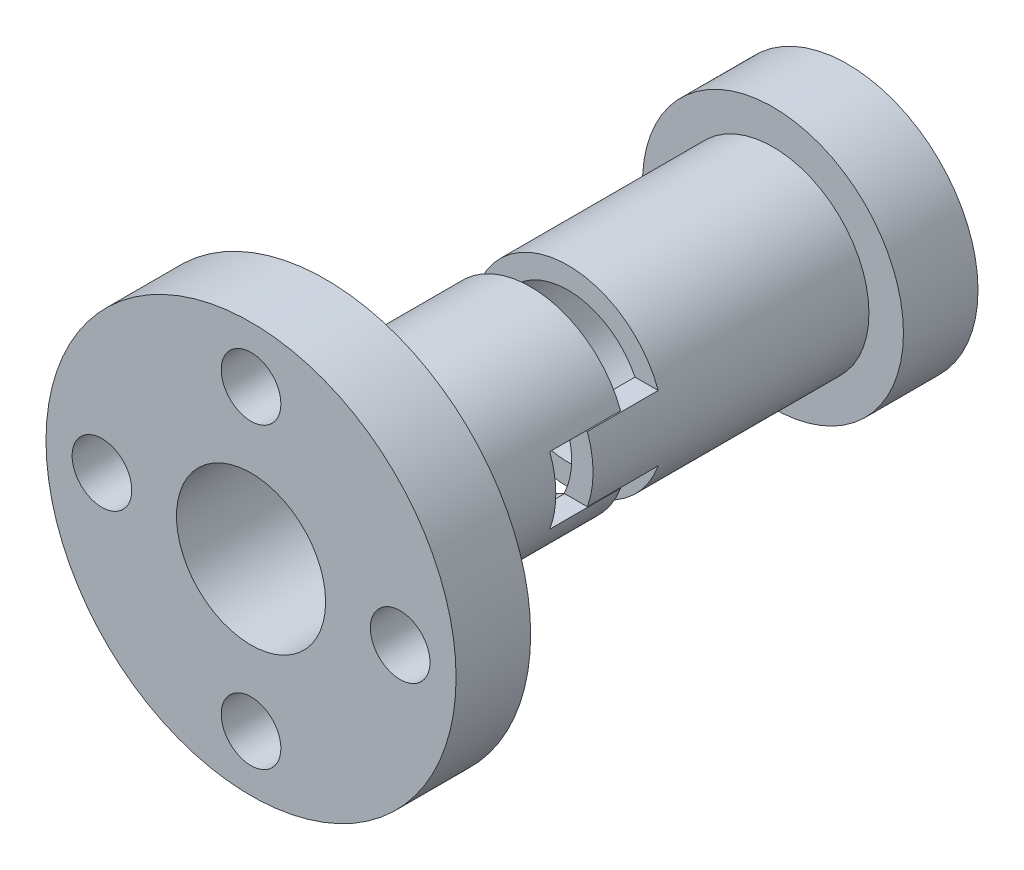
ISO-10303-21;
HEADER;
FILE_DESCRIPTION(('STEP AP214'),'2;1');
FILE_NAME('part.step','',(''),(''),'','','');
FILE_SCHEMA(('AUTOMOTIVE_DESIGN { 1 0 10303 214 1 1 1 1 }'));
ENDSEC;
DATA;
#1=APPLICATION_CONTEXT('core data for automotive mechanical design processes');
#2=APPLICATION_PROTOCOL_DEFINITION('international standard','automotive_design',2000,#1);
#3=PRODUCT_CONTEXT('',#1,'mechanical');
#4=PRODUCT('Part','Part','',(#3));
#5=PRODUCT_RELATED_PRODUCT_CATEGORY('part','',(#4));
#6=PRODUCT_DEFINITION_FORMATION('','',#4);
#7=PRODUCT_DEFINITION_CONTEXT('part definition',#1,'design');
#8=PRODUCT_DEFINITION('design','',#6,#7);
#9=PRODUCT_DEFINITION_SHAPE('','',#8);
#10=(LENGTH_UNIT() NAMED_UNIT(*) SI_UNIT(.MILLI.,.METRE.));
#11=(NAMED_UNIT(*) PLANE_ANGLE_UNIT() SI_UNIT($,.RADIAN.));
#12=(NAMED_UNIT(*) SI_UNIT($,.STERADIAN.) SOLID_ANGLE_UNIT());
#13=UNCERTAINTY_MEASURE_WITH_UNIT(LENGTH_MEASURE(1.E-05),#10,'distance_accuracy_value','');
#14=(GEOMETRIC_REPRESENTATION_CONTEXT(3) GLOBAL_UNCERTAINTY_ASSIGNED_CONTEXT((#13)) GLOBAL_UNIT_ASSIGNED_CONTEXT((#10,
#11,#12)) REPRESENTATION_CONTEXT('',''));
#15=CARTESIAN_POINT('',(0.,0.,0.));
#16=DIRECTION('',(0.,0.,1.));
#17=DIRECTION('',(1.,0.,0.));
#18=AXIS2_PLACEMENT_3D('',#15,#16,#17);
#19=CARTESIAN_POINT('',(0.,0.,0.));
#20=DIRECTION('',(0.,0.,1.));
#21=DIRECTION('',(1.,0.,0.));
#22=AXIS2_PLACEMENT_3D('',#19,#20,#21);
#23=CYLINDRICAL_SURFACE('',#22,4.);
#24=DIRECTION('',(0.,0.,1.));
#25=VECTOR('',#24,1.);
#26=CARTESIAN_POINT('',(3.59687364248454,1.75,0.));
#27=LINE('',#26,#25);
#28=CARTESIAN_POINT('',(3.59687364248454,1.75,-13.2));
#29=VERTEX_POINT('',#28);
#30=CARTESIAN_POINT('',(3.59687364248454,1.75,-17.));
#31=VERTEX_POINT('',#30);
#32=EDGE_CURVE('E168',#29,#31,#27,.F.);
#33=ORIENTED_EDGE('',*,*,#32,.T.);
#34=CARTESIAN_POINT('',(0.,0.,-17.));
#35=DIRECTION('',(0.,0.,-1.));
#36=DIRECTION('',(-1.,0.,0.));
#37=AXIS2_PLACEMENT_3D('',#34,#35,#36);
#38=CIRCLE('',#37,4.);
#39=CARTESIAN_POINT('',(-3.59687364248454,1.75,-17.));
#40=VERTEX_POINT('',#39);
#41=EDGE_CURVE('E164',#31,#40,#38,.F.);
#42=ORIENTED_EDGE('',*,*,#41,.T.);
#43=DIRECTION('',(0.,0.,1.));
#44=VECTOR('',#43,1.);
#45=CARTESIAN_POINT('',(-3.59687364248454,1.75,0.));
#46=LINE('',#45,#44);
#47=CARTESIAN_POINT('',(-3.59687364248454,1.75,-13.2));
#48=VERTEX_POINT('',#47);
#49=EDGE_CURVE('E167',#40,#48,#46,.T.);
#50=ORIENTED_EDGE('',*,*,#49,.T.);
#51=CARTESIAN_POINT('',(0.,0.,-13.2));
#52=DIRECTION('',(0.,0.,-1.));
#53=DIRECTION('',(-1.,0.,0.));
#54=AXIS2_PLACEMENT_3D('',#51,#52,#53);
#55=CIRCLE('',#54,4.);
#56=CARTESIAN_POINT('',(-3.59687364248454,-1.75,-13.2));
#57=VERTEX_POINT('',#56);
#58=EDGE_CURVE('E173',#48,#57,#55,.F.);
#59=ORIENTED_EDGE('',*,*,#58,.T.);
#60=DIRECTION('',(0.,0.,1.));
#61=VECTOR('',#60,1.);
#62=CARTESIAN_POINT('',(-3.59687364248454,-1.75,0.));
#63=LINE('',#62,#61);
#64=CARTESIAN_POINT('',(-3.59687364248454,-1.75,-17.));
#65=VERTEX_POINT('',#64);
#66=EDGE_CURVE('E134',#57,#65,#63,.F.);
#67=ORIENTED_EDGE('',*,*,#66,.T.);
#68=CARTESIAN_POINT('',(0.,0.,-17.));
#69=DIRECTION('',(0.,0.,-1.));
#70=DIRECTION('',(-1.,0.,0.));
#71=AXIS2_PLACEMENT_3D('',#68,#69,#70);
#72=CIRCLE('',#71,4.);
#73=CARTESIAN_POINT('',(3.59687364248454,-1.75,-17.));
#74=VERTEX_POINT('',#73);
#75=EDGE_CURVE('E67',#65,#74,#72,.F.);
#76=ORIENTED_EDGE('',*,*,#75,.T.);
#77=DIRECTION('',(0.,0.,1.));
#78=VECTOR('',#77,1.);
#79=CARTESIAN_POINT('',(3.59687364248454,-1.75,0.));
#80=LINE('',#79,#78);
#81=CARTESIAN_POINT('',(3.59687364248454,-1.75,-13.2));
#82=VERTEX_POINT('',#81);
#83=EDGE_CURVE('E176',#74,#82,#80,.T.);
#84=ORIENTED_EDGE('',*,*,#83,.T.);
#85=EDGE_CURVE('E155',#82,#29,#55,.F.);
#86=ORIENTED_EDGE('',*,*,#85,.T.);
#87=EDGE_LOOP('',(#33,#42,#50,#59,#67,#76,#84,#86));
#88=FACE_BOUND('',#87,.T.);
#89=CARTESIAN_POINT('',(0.,0.,-32.));
#90=DIRECTION('',(0.,0.,1.));
#91=DIRECTION('',(1.,0.,0.));
#92=AXIS2_PLACEMENT_3D('',#89,#90,#91);
#93=CIRCLE('',#92,4.);
#94=CARTESIAN_POINT('',(4.,0.,-32.));
#95=VERTEX_POINT('',#94);
#96=EDGE_CURVE('E161',#95,#95,#93,.T.);
#97=ORIENTED_EDGE('',*,*,#96,.F.);
#98=EDGE_LOOP('',(#97));
#99=FACE_BOUND('',#98,.T.);
#100=ADVANCED_FACE('F50',(#88,#99),#23,.F.);
#101=CARTESIAN_POINT('',(0.,0.,0.));
#102=DIRECTION('',(0.,0.,1.));
#103=DIRECTION('',(1.,0.,0.));
#104=AXIS2_PLACEMENT_3D('',#101,#102,#103);
#105=CYLINDRICAL_SURFACE('',#104,5.15);
#106=CARTESIAN_POINT('',(0.,0.,-28.));
#107=DIRECTION('',(0.,0.,1.));
#108=DIRECTION('',(1.,0.,0.));
#109=AXIS2_PLACEMENT_3D('',#106,#107,#108);
#110=CIRCLE('',#109,5.15);
#111=CARTESIAN_POINT('',(5.15,0.,-28.));
#112=VERTEX_POINT('',#111);
#113=EDGE_CURVE('E152',#112,#112,#110,.T.);
#114=ORIENTED_EDGE('',*,*,#113,.T.);
#115=EDGE_LOOP('',(#114));
#116=FACE_BOUND('',#115,.T.);
#117=DIRECTION('',(0.,0.,1.));
#118=VECTOR('',#117,1.);
#119=CARTESIAN_POINT('',(-4.84355241532493,1.75,0.));
#120=LINE('',#119,#118);
#121=CARTESIAN_POINT('',(-4.84355241532493,1.75,-13.2));
#122=VERTEX_POINT('',#121);
#123=CARTESIAN_POINT('',(-4.84355241532493,1.75,-17.));
#124=VERTEX_POINT('',#123);
#125=EDGE_CURVE('E143',#122,#124,#120,.F.);
#126=ORIENTED_EDGE('',*,*,#125,.T.);
#127=CARTESIAN_POINT('',(0.,0.,-17.));
#128=DIRECTION('',(0.,0.,-1.));
#129=DIRECTION('',(-1.,0.,0.));
#130=AXIS2_PLACEMENT_3D('',#127,#128,#129);
#131=CIRCLE('',#130,5.15);
#132=CARTESIAN_POINT('',(4.84355241532494,1.75,-17.));
#133=VERTEX_POINT('',#132);
#134=EDGE_CURVE('E150',#124,#133,#131,.T.);
#135=ORIENTED_EDGE('',*,*,#134,.T.);
#136=DIRECTION('',(0.,0.,1.));
#137=VECTOR('',#136,1.);
#138=CARTESIAN_POINT('',(4.84355241532493,1.75,0.));
#139=LINE('',#138,#137);
#140=CARTESIAN_POINT('',(4.84355241532493,1.75,-13.2));
#141=VERTEX_POINT('',#140);
#142=EDGE_CURVE('E147',#133,#141,#139,.T.);
#143=ORIENTED_EDGE('',*,*,#142,.T.);
#144=CARTESIAN_POINT('',(0.,0.,-13.2));
#145=DIRECTION('',(0.,0.,-1.));
#146=DIRECTION('',(-1.,0.,0.));
#147=AXIS2_PLACEMENT_3D('',#144,#145,#146);
#148=CIRCLE('',#147,5.15);
#149=CARTESIAN_POINT('',(4.84355241532494,-1.75,-13.2));
#150=VERTEX_POINT('',#149);
#151=EDGE_CURVE('E129',#141,#150,#148,.T.);
#152=ORIENTED_EDGE('',*,*,#151,.T.);
#153=DIRECTION('',(0.,0.,1.));
#154=VECTOR('',#153,1.);
#155=CARTESIAN_POINT('',(4.84355241532494,-1.75,0.));
#156=LINE('',#155,#154);
#157=CARTESIAN_POINT('',(4.84355241532493,-1.75,-17.));
#158=VERTEX_POINT('',#157);
#159=EDGE_CURVE('E140',#150,#158,#156,.F.);
#160=ORIENTED_EDGE('',*,*,#159,.T.);
#161=CARTESIAN_POINT('',(0.,0.,-17.));
#162=DIRECTION('',(0.,0.,-1.));
#163=DIRECTION('',(-1.,0.,0.));
#164=AXIS2_PLACEMENT_3D('',#161,#162,#163);
#165=CIRCLE('',#164,5.15);
#166=CARTESIAN_POINT('',(-4.84355241532493,-1.75,-17.));
#167=VERTEX_POINT('',#166);
#168=EDGE_CURVE('E138',#158,#167,#165,.T.);
#169=ORIENTED_EDGE('',*,*,#168,.T.);
#170=DIRECTION('',(0.,0.,1.));
#171=VECTOR('',#170,1.);
#172=CARTESIAN_POINT('',(-4.84355241532494,-1.75,0.));
#173=LINE('',#172,#171);
#174=CARTESIAN_POINT('',(-4.84355241532494,-1.75,-13.2));
#175=VERTEX_POINT('',#174);
#176=EDGE_CURVE('E127',#167,#175,#173,.T.);
#177=ORIENTED_EDGE('',*,*,#176,.T.);
#178=EDGE_CURVE('E116',#175,#122,#148,.T.);
#179=ORIENTED_EDGE('',*,*,#178,.T.);
#180=EDGE_LOOP('',(#126,#135,#143,#152,#160,#169,#177,#179));
#181=FACE_BOUND('',#180,.T.);
#182=ADVANCED_FACE('F52',(#116,#181),#105,.T.);
#183=CARTESIAN_POINT('',(0.,5.15,-28.));
#184=DIRECTION('',(0.,0.,-1.));
#185=DIRECTION('',(-1.,0.,0.));
#186=AXIS2_PLACEMENT_3D('',#183,#184,#185);
#187=PLANE('',#186);
#188=ORIENTED_EDGE('',*,*,#113,.F.);
#189=EDGE_LOOP('',(#188));
#190=FACE_BOUND('',#189,.T.);
#191=CARTESIAN_POINT('',(0.,0.,-28.));
#192=DIRECTION('',(0.,0.,1.));
#193=DIRECTION('',(1.,0.,0.));
#194=AXIS2_PLACEMENT_3D('',#191,#192,#193);
#195=CIRCLE('',#194,7.);
#196=CARTESIAN_POINT('',(7.,0.,-28.));
#197=VERTEX_POINT('',#196);
#198=EDGE_CURVE('E126',#197,#197,#195,.T.);
#199=ORIENTED_EDGE('',*,*,#198,.T.);
#200=EDGE_LOOP('',(#199));
#201=FACE_BOUND('',#200,.T.);
#202=ADVANCED_FACE('F215',(#190,#201),#187,.F.);
#203=CARTESIAN_POINT('',(0.,0.,0.));
#204=DIRECTION('',(0.,0.,1.));
#205=DIRECTION('',(1.,0.,0.));
#206=AXIS2_PLACEMENT_3D('',#203,#204,#205);
#207=CYLINDRICAL_SURFACE('',#206,7.);
#208=ORIENTED_EDGE('',*,*,#198,.F.);
#209=EDGE_LOOP('',(#208));
#210=FACE_BOUND('',#209,.T.);
#211=CARTESIAN_POINT('',(0.,0.,-32.));
#212=DIRECTION('',(0.,0.,1.));
#213=DIRECTION('',(1.,0.,0.));
#214=AXIS2_PLACEMENT_3D('',#211,#212,#213);
#215=CIRCLE('',#214,7.);
#216=CARTESIAN_POINT('',(7.,0.,-32.));
#217=VERTEX_POINT('',#216);
#218=EDGE_CURVE('E158',#217,#217,#215,.T.);
#219=ORIENTED_EDGE('',*,*,#218,.T.);
#220=EDGE_LOOP('',(#219));
#221=FACE_BOUND('',#220,.T.);
#222=ADVANCED_FACE('F222',(#210,#221),#207,.T.);
#223=CARTESIAN_POINT('',(0.,7.,-32.));
#224=DIRECTION('',(0.,0.,1.));
#225=DIRECTION('',(1.,0.,0.));
#226=AXIS2_PLACEMENT_3D('',#223,#224,#225);
#227=PLANE('',#226);
#228=ORIENTED_EDGE('',*,*,#218,.F.);
#229=EDGE_LOOP('',(#228));
#230=FACE_BOUND('',#229,.T.);
#231=ORIENTED_EDGE('',*,*,#96,.T.);
#232=EDGE_LOOP('',(#231));
#233=FACE_BOUND('',#232,.T.);
#234=ADVANCED_FACE('F218',(#230,#233),#227,.F.);
#235=CARTESIAN_POINT('',(-11.,5.15,-17.));
#236=DIRECTION('',(0.,0.,-1.));
#237=DIRECTION('',(-1.,0.,0.));
#238=AXIS2_PLACEMENT_3D('',#235,#236,#237);
#239=PLANE('',#238);
#240=DIRECTION('',(1.,0.,0.));
#241=VECTOR('',#240,1.);
#242=CARTESIAN_POINT('',(-11.,1.75,-17.));
#243=LINE('',#242,#241);
#244=EDGE_CURVE('E54',#31,#133,#243,.T.);
#245=ORIENTED_EDGE('',*,*,#244,.T.);
#246=ORIENTED_EDGE('',*,*,#134,.F.);
#247=EDGE_CURVE('E182',#124,#40,#243,.T.);
#248=ORIENTED_EDGE('',*,*,#247,.T.);
#249=ORIENTED_EDGE('',*,*,#41,.F.);
#250=EDGE_LOOP('',(#245,#246,#248,#249));
#251=FACE_BOUND('',#250,.T.);
#252=ADVANCED_FACE('F191',(#251),#239,.F.);
#253=CARTESIAN_POINT('',(-11.,1.75,-17.));
#254=DIRECTION('',(0.,-1.,0.));
#255=DIRECTION('',(0.,0.,-1.));
#256=AXIS2_PLACEMENT_3D('',#253,#254,#255);
#257=PLANE('',#256);
#258=DIRECTION('',(1.,0.,0.));
#259=VECTOR('',#258,1.);
#260=CARTESIAN_POINT('',(-11.,1.75,-13.2));
#261=LINE('',#260,#259);
#262=EDGE_CURVE('E180',#29,#141,#261,.T.);
#263=ORIENTED_EDGE('',*,*,#262,.T.);
#264=ORIENTED_EDGE('',*,*,#142,.F.);
#265=ORIENTED_EDGE('',*,*,#244,.F.);
#266=ORIENTED_EDGE('',*,*,#32,.F.);
#267=EDGE_LOOP('',(#263,#264,#265,#266));
#268=FACE_BOUND('',#267,.T.);
#269=ADVANCED_FACE('F192',(#268),#257,.F.);
#270=ORIENTED_EDGE('',*,*,#247,.F.);
#271=ORIENTED_EDGE('',*,*,#125,.F.);
#272=EDGE_CURVE('E122',#122,#48,#261,.T.);
#273=ORIENTED_EDGE('',*,*,#272,.T.);
#274=ORIENTED_EDGE('',*,*,#49,.F.);
#275=EDGE_LOOP('',(#270,#271,#273,#274));
#276=FACE_BOUND('',#275,.T.);
#277=ADVANCED_FACE('F202',(#276),#257,.F.);
#278=CARTESIAN_POINT('',(-11.,1.75,-13.2));
#279=DIRECTION('',(0.,0.,-1.));
#280=DIRECTION('',(-1.,0.,0.));
#281=AXIS2_PLACEMENT_3D('',#278,#279,#280);
#282=PLANE('',#281);
#283=DIRECTION('',(1.,0.,0.));
#284=VECTOR('',#283,1.);
#285=CARTESIAN_POINT('',(-11.,-1.75,-13.2));
#286=LINE('',#285,#284);
#287=EDGE_CURVE('E135',#82,#150,#286,.T.);
#288=ORIENTED_EDGE('',*,*,#287,.T.);
#289=ORIENTED_EDGE('',*,*,#151,.F.);
#290=ORIENTED_EDGE('',*,*,#262,.F.);
#291=ORIENTED_EDGE('',*,*,#85,.F.);
#292=EDGE_LOOP('',(#288,#289,#290,#291));
#293=FACE_BOUND('',#292,.T.);
#294=ADVANCED_FACE('F198',(#293),#282,.F.);
#295=ORIENTED_EDGE('',*,*,#272,.F.);
#296=ORIENTED_EDGE('',*,*,#178,.F.);
#297=EDGE_CURVE('E119',#175,#57,#286,.T.);
#298=ORIENTED_EDGE('',*,*,#297,.T.);
#299=ORIENTED_EDGE('',*,*,#58,.F.);
#300=EDGE_LOOP('',(#295,#296,#298,#299));
#301=FACE_BOUND('',#300,.T.);
#302=ADVANCED_FACE('F118',(#301),#282,.F.);
#303=CARTESIAN_POINT('',(-11.,-1.75,-13.2));
#304=DIRECTION('',(0.,1.,0.));
#305=DIRECTION('',(0.,0.,1.));
#306=AXIS2_PLACEMENT_3D('',#303,#304,#305);
#307=PLANE('',#306);
#308=ORIENTED_EDGE('',*,*,#297,.F.);
#309=ORIENTED_EDGE('',*,*,#176,.F.);
#310=DIRECTION('',(1.,0.,0.));
#311=VECTOR('',#310,1.);
#312=CARTESIAN_POINT('',(-11.,-1.75,-17.));
#313=LINE('',#312,#311);
#314=EDGE_CURVE('E59',#167,#65,#313,.T.);
#315=ORIENTED_EDGE('',*,*,#314,.T.);
#316=ORIENTED_EDGE('',*,*,#66,.F.);
#317=EDGE_LOOP('',(#308,#309,#315,#316));
#318=FACE_BOUND('',#317,.T.);
#319=ADVANCED_FACE('F132',(#318),#307,.F.);
#320=EDGE_CURVE('E12',#74,#158,#313,.T.);
#321=ORIENTED_EDGE('',*,*,#320,.T.);
#322=ORIENTED_EDGE('',*,*,#159,.F.);
#323=ORIENTED_EDGE('',*,*,#287,.F.);
#324=ORIENTED_EDGE('',*,*,#83,.F.);
#325=EDGE_LOOP('',(#321,#322,#323,#324));
#326=FACE_BOUND('',#325,.T.);
#327=ADVANCED_FACE('F200',(#326),#307,.F.);
#328=CARTESIAN_POINT('',(-11.,-1.75,-17.));
#329=DIRECTION('',(0.,0.,-1.));
#330=DIRECTION('',(-1.,0.,0.));
#331=AXIS2_PLACEMENT_3D('',#328,#329,#330);
#332=PLANE('',#331);
#333=ORIENTED_EDGE('',*,*,#314,.F.);
#334=ORIENTED_EDGE('',*,*,#168,.F.);
#335=ORIENTED_EDGE('',*,*,#320,.F.);
#336=ORIENTED_EDGE('',*,*,#75,.F.);
#337=EDGE_LOOP('',(#333,#334,#335,#336));
#338=FACE_BOUND('',#337,.T.);
#339=ADVANCED_FACE('F234',(#338),#332,.F.);
#340=CLOSED_SHELL('',(#100,#182,#202,#222,#234,#252,#269,#277,#294,#302,#319,#327,#339));
#341=MANIFOLD_SOLID_BREP('B2',#340);
#342=CARTESIAN_POINT('',(0.,0.,0.));
#343=DIRECTION('',(0.,0.,1.));
#344=DIRECTION('',(1.,0.,0.));
#345=AXIS2_PLACEMENT_3D('',#342,#343,#344);
#346=CYLINDRICAL_SURFACE('',#345,11.);
#347=CARTESIAN_POINT('',(0.,0.,0.));
#348=DIRECTION('',(0.,0.,1.));
#349=DIRECTION('',(1.,0.,0.));
#350=AXIS2_PLACEMENT_3D('',#347,#348,#349);
#351=CIRCLE('',#350,11.);
#352=CARTESIAN_POINT('',(11.,0.,0.));
#353=VERTEX_POINT('',#352);
#354=EDGE_CURVE('E443',#353,#353,#351,.T.);
#355=ORIENTED_EDGE('',*,*,#354,.F.);
#356=EDGE_LOOP('',(#355));
#357=FACE_BOUND('',#356,.T.);
#358=CARTESIAN_POINT('',(0.,0.,-4.));
#359=DIRECTION('',(0.,0.,1.));
#360=DIRECTION('',(1.,0.,0.));
#361=AXIS2_PLACEMENT_3D('',#358,#359,#360);
#362=CIRCLE('',#361,11.);
#363=CARTESIAN_POINT('',(11.,0.,-4.));
#364=VERTEX_POINT('',#363);
#365=EDGE_CURVE('E446',#364,#364,#362,.T.);
#366=ORIENTED_EDGE('',*,*,#365,.T.);
#367=EDGE_LOOP('',(#366));
#368=FACE_BOUND('',#367,.T.);
#369=ADVANCED_FACE('F325',(#357,#368),#346,.T.);
#370=CARTESIAN_POINT('',(8.,0.,0.));
#371=DIRECTION('',(0.,0.,1.));
#372=DIRECTION('',(1.,0.,0.));
#373=AXIS2_PLACEMENT_3D('',#370,#371,#372);
#374=CYLINDRICAL_SURFACE('',#373,1.6);
#375=CARTESIAN_POINT('',(8.,0.,0.));
#376=DIRECTION('',(0.,0.,1.));
#377=DIRECTION('',(1.,0.,0.));
#378=AXIS2_PLACEMENT_3D('',#375,#376,#377);
#379=CIRCLE('',#378,1.6);
#380=CARTESIAN_POINT('',(9.6,0.,0.));
#381=VERTEX_POINT('',#380);
#382=EDGE_CURVE('E435',#381,#381,#379,.T.);
#383=ORIENTED_EDGE('',*,*,#382,.T.);
#384=EDGE_LOOP('',(#383));
#385=FACE_BOUND('',#384,.T.);
#386=CARTESIAN_POINT('',(8.,0.,-4.));
#387=DIRECTION('',(0.,0.,1.));
#388=DIRECTION('',(1.,0.,0.));
#389=AXIS2_PLACEMENT_3D('',#386,#387,#388);
#390=CIRCLE('',#389,1.6);
#391=CARTESIAN_POINT('',(9.6,0.,-4.));
#392=VERTEX_POINT('',#391);
#393=EDGE_CURVE('E437',#392,#392,#390,.T.);
#394=ORIENTED_EDGE('',*,*,#393,.F.);
#395=EDGE_LOOP('',(#394));
#396=FACE_BOUND('',#395,.T.);
#397=ADVANCED_FACE('F514',(#385,#396),#374,.F.);
#398=CARTESIAN_POINT('',(0.,8.,0.));
#399=DIRECTION('',(0.,0.,1.));
#400=DIRECTION('',(1.,0.,0.));
#401=AXIS2_PLACEMENT_3D('',#398,#399,#400);
#402=CYLINDRICAL_SURFACE('',#401,1.6);
#403=CARTESIAN_POINT('',(0.,8.,0.));
#404=DIRECTION('',(0.,0.,1.));
#405=DIRECTION('',(1.,0.,0.));
#406=AXIS2_PLACEMENT_3D('',#403,#404,#405);
#407=CIRCLE('',#406,1.6);
#408=CARTESIAN_POINT('',(1.59999999999997,8.,0.));
#409=VERTEX_POINT('',#408);
#410=EDGE_CURVE('E436',#409,#409,#407,.T.);
#411=ORIENTED_EDGE('',*,*,#410,.T.);
#412=EDGE_LOOP('',(#411));
#413=FACE_BOUND('',#412,.T.);
#414=CARTESIAN_POINT('',(0.,8.,-4.));
#415=DIRECTION('',(0.,0.,1.));
#416=DIRECTION('',(1.,0.,0.));
#417=AXIS2_PLACEMENT_3D('',#414,#415,#416);
#418=CIRCLE('',#417,1.6);
#419=CARTESIAN_POINT('',(1.59999999999997,8.,-4.));
#420=VERTEX_POINT('',#419);
#421=EDGE_CURVE('E432',#420,#420,#418,.T.);
#422=ORIENTED_EDGE('',*,*,#421,.F.);
#423=EDGE_LOOP('',(#422));
#424=FACE_BOUND('',#423,.T.);
#425=ADVANCED_FACE('F520',(#413,#424),#402,.F.);
#426=CARTESIAN_POINT('',(-8.,0.,0.));
#427=DIRECTION('',(0.,0.,1.));
#428=DIRECTION('',(1.,0.,0.));
#429=AXIS2_PLACEMENT_3D('',#426,#427,#428);
#430=CYLINDRICAL_SURFACE('',#429,1.6);
#431=CARTESIAN_POINT('',(-8.,0.,0.));
#432=DIRECTION('',(0.,0.,1.));
#433=DIRECTION('',(1.,0.,0.));
#434=AXIS2_PLACEMENT_3D('',#431,#432,#433);
#435=CIRCLE('',#434,1.6);
#436=CARTESIAN_POINT('',(-6.4,0.,0.));
#437=VERTEX_POINT('',#436);
#438=EDGE_CURVE('E430',#437,#437,#435,.T.);
#439=ORIENTED_EDGE('',*,*,#438,.T.);
#440=EDGE_LOOP('',(#439));
#441=FACE_BOUND('',#440,.T.);
#442=CARTESIAN_POINT('',(-8.,0.,-4.));
#443=DIRECTION('',(0.,0.,1.));
#444=DIRECTION('',(1.,0.,0.));
#445=AXIS2_PLACEMENT_3D('',#442,#443,#444);
#446=CIRCLE('',#445,1.6);
#447=CARTESIAN_POINT('',(-6.4,0.,-4.));
#448=VERTEX_POINT('',#447);
#449=EDGE_CURVE('E455',#448,#448,#446,.T.);
#450=ORIENTED_EDGE('',*,*,#449,.F.);
#451=EDGE_LOOP('',(#450));
#452=FACE_BOUND('',#451,.T.);
#453=ADVANCED_FACE('F530',(#441,#452),#430,.F.);
#454=CARTESIAN_POINT('',(0.,4.,0.));
#455=DIRECTION('',(0.,0.,-1.));
#456=DIRECTION('',(-1.,0.,0.));
#457=AXIS2_PLACEMENT_3D('',#454,#455,#456);
#458=PLANE('',#457);
#459=CARTESIAN_POINT('',(0.,-8.,0.));
#460=DIRECTION('',(0.,0.,1.));
#461=DIRECTION('',(1.,0.,0.));
#462=AXIS2_PLACEMENT_3D('',#459,#460,#461);
#463=CIRCLE('',#462,1.6);
#464=CARTESIAN_POINT('',(1.60000000000008,-8.,0.));
#465=VERTEX_POINT('',#464);
#466=EDGE_CURVE('E431',#465,#465,#463,.T.);
#467=ORIENTED_EDGE('',*,*,#466,.F.);
#468=EDGE_LOOP('',(#467));
#469=FACE_BOUND('',#468,.T.);
#470=ORIENTED_EDGE('',*,*,#438,.F.);
#471=EDGE_LOOP('',(#470));
#472=FACE_BOUND('',#471,.T.);
#473=ORIENTED_EDGE('',*,*,#410,.F.);
#474=EDGE_LOOP('',(#473));
#475=FACE_BOUND('',#474,.T.);
#476=ORIENTED_EDGE('',*,*,#382,.F.);
#477=EDGE_LOOP('',(#476));
#478=FACE_BOUND('',#477,.T.);
#479=CARTESIAN_POINT('',(0.,0.,0.));
#480=DIRECTION('',(0.,0.,1.));
#481=DIRECTION('',(1.,0.,0.));
#482=AXIS2_PLACEMENT_3D('',#479,#480,#481);
#483=CIRCLE('',#482,4.);
#484=CARTESIAN_POINT('',(4.,0.,0.));
#485=VERTEX_POINT('',#484);
#486=EDGE_CURVE('E426',#485,#485,#483,.T.);
#487=ORIENTED_EDGE('',*,*,#486,.F.);
#488=EDGE_LOOP('',(#487));
#489=FACE_BOUND('',#488,.T.);
#490=ORIENTED_EDGE('',*,*,#354,.T.);
#491=EDGE_LOOP('',(#490));
#492=FACE_BOUND('',#491,.T.);
#493=ADVANCED_FACE('F528',(#469,#472,#475,#478,#489,#492),#458,.F.);
#494=CARTESIAN_POINT('',(0.,0.,0.));
#495=DIRECTION('',(0.,0.,1.));
#496=DIRECTION('',(1.,0.,0.));
#497=AXIS2_PLACEMENT_3D('',#494,#495,#496);
#498=CYLINDRICAL_SURFACE('',#497,4.);
#499=CARTESIAN_POINT('',(0.,0.,-15.));
#500=DIRECTION('',(0.,0.,1.));
#501=DIRECTION('',(1.,0.,0.));
#502=AXIS2_PLACEMENT_3D('',#499,#500,#501);
#503=CIRCLE('',#502,4.);
#504=CARTESIAN_POINT('',(3.57211421989835,-1.8,-15.));
#505=VERTEX_POINT('',#504);
#506=CARTESIAN_POINT('',(-3.57211421989835,-1.8,-15.));
#507=VERTEX_POINT('',#506);
#508=EDGE_CURVE('E465',#505,#507,#503,.F.);
#509=ORIENTED_EDGE('',*,*,#508,.T.);
#510=DIRECTION('',(0.,0.,1.));
#511=VECTOR('',#510,1.);
#512=CARTESIAN_POINT('',(-3.57211421989835,-1.8,0.));
#513=LINE('',#512,#511);
#514=CARTESIAN_POINT('',(-3.57211421989835,-1.8,-11.2));
#515=VERTEX_POINT('',#514);
#516=EDGE_CURVE('E471',#507,#515,#513,.T.);
#517=ORIENTED_EDGE('',*,*,#516,.T.);
#518=CARTESIAN_POINT('',(0.,0.,-11.2));
#519=DIRECTION('',(0.,0.,1.));
#520=DIRECTION('',(1.,0.,0.));
#521=AXIS2_PLACEMENT_3D('',#518,#519,#520);
#522=CIRCLE('',#521,4.);
#523=CARTESIAN_POINT('',(-3.57211421989835,1.8,-11.2));
#524=VERTEX_POINT('',#523);
#525=EDGE_CURVE('E474',#515,#524,#522,.F.);
#526=ORIENTED_EDGE('',*,*,#525,.T.);
#527=DIRECTION('',(0.,0.,1.));
#528=VECTOR('',#527,1.);
#529=CARTESIAN_POINT('',(-3.57211421989835,1.8,0.));
#530=LINE('',#529,#528);
#531=CARTESIAN_POINT('',(-3.57211421989835,1.8,-15.));
#532=VERTEX_POINT('',#531);
#533=EDGE_CURVE('E407',#524,#532,#530,.F.);
#534=ORIENTED_EDGE('',*,*,#533,.T.);
#535=CARTESIAN_POINT('',(0.,0.,-15.));
#536=DIRECTION('',(0.,0.,1.));
#537=DIRECTION('',(1.,0.,0.));
#538=AXIS2_PLACEMENT_3D('',#535,#536,#537);
#539=CIRCLE('',#538,4.);
#540=CARTESIAN_POINT('',(3.57211421989835,1.8,-15.));
#541=VERTEX_POINT('',#540);
#542=EDGE_CURVE('E462',#532,#541,#539,.F.);
#543=ORIENTED_EDGE('',*,*,#542,.T.);
#544=DIRECTION('',(0.,0.,1.));
#545=VECTOR('',#544,1.);
#546=CARTESIAN_POINT('',(3.57211421989835,1.8,0.));
#547=LINE('',#546,#545);
#548=CARTESIAN_POINT('',(3.57211421989835,1.8,-11.2));
#549=VERTEX_POINT('',#548);
#550=EDGE_CURVE('E479',#541,#549,#547,.T.);
#551=ORIENTED_EDGE('',*,*,#550,.T.);
#552=CARTESIAN_POINT('',(3.57211421989835,-1.8,-11.2));
#553=VERTEX_POINT('',#552);
#554=EDGE_CURVE('E475',#549,#553,#522,.F.);
#555=ORIENTED_EDGE('',*,*,#554,.T.);
#556=DIRECTION('',(0.,0.,1.));
#557=VECTOR('',#556,1.);
#558=CARTESIAN_POINT('',(3.57211421989835,-1.8,0.));
#559=LINE('',#558,#557);
#560=EDGE_CURVE('E468',#553,#505,#559,.F.);
#561=ORIENTED_EDGE('',*,*,#560,.T.);
#562=EDGE_LOOP('',(#509,#517,#526,#534,#543,#551,#555,#561));
#563=FACE_BOUND('',#562,.T.);
#564=ORIENTED_EDGE('',*,*,#486,.T.);
#565=EDGE_LOOP('',(#564));
#566=FACE_BOUND('',#565,.T.);
#567=ADVANCED_FACE('F327',(#563,#566),#498,.F.);
#568=CARTESIAN_POINT('',(0.,-8.,0.));
#569=DIRECTION('',(0.,0.,1.));
#570=DIRECTION('',(1.,0.,0.));
#571=AXIS2_PLACEMENT_3D('',#568,#569,#570);
#572=CYLINDRICAL_SURFACE('',#571,1.6);
#573=ORIENTED_EDGE('',*,*,#466,.T.);
#574=EDGE_LOOP('',(#573));
#575=FACE_BOUND('',#574,.T.);
#576=CARTESIAN_POINT('',(0.,-8.,-4.));
#577=DIRECTION('',(0.,0.,1.));
#578=DIRECTION('',(1.,0.,0.));
#579=AXIS2_PLACEMENT_3D('',#576,#577,#578);
#580=CIRCLE('',#579,1.6);
#581=CARTESIAN_POINT('',(1.60000000000008,-8.,-4.));
#582=VERTEX_POINT('',#581);
#583=EDGE_CURVE('E427',#582,#582,#580,.T.);
#584=ORIENTED_EDGE('',*,*,#583,.F.);
#585=EDGE_LOOP('',(#584));
#586=FACE_BOUND('',#585,.T.);
#587=ADVANCED_FACE('F536',(#575,#586),#572,.F.);
#588=CARTESIAN_POINT('',(0.,11.,-4.));
#589=DIRECTION('',(0.,0.,1.));
#590=DIRECTION('',(1.,0.,0.));
#591=AXIS2_PLACEMENT_3D('',#588,#589,#590);
#592=PLANE('',#591);
#593=ORIENTED_EDGE('',*,*,#583,.T.);
#594=EDGE_LOOP('',(#593));
#595=FACE_BOUND('',#594,.T.);
#596=ORIENTED_EDGE('',*,*,#449,.T.);
#597=EDGE_LOOP('',(#596));
#598=FACE_BOUND('',#597,.T.);
#599=ORIENTED_EDGE('',*,*,#421,.T.);
#600=EDGE_LOOP('',(#599));
#601=FACE_BOUND('',#600,.T.);
#602=ORIENTED_EDGE('',*,*,#393,.T.);
#603=EDGE_LOOP('',(#602));
#604=FACE_BOUND('',#603,.T.);
#605=ORIENTED_EDGE('',*,*,#365,.F.);
#606=EDGE_LOOP('',(#605));
#607=FACE_BOUND('',#606,.T.);
#608=CARTESIAN_POINT('',(0.,0.,-4.));
#609=DIRECTION('',(0.,0.,1.));
#610=DIRECTION('',(1.,0.,0.));
#611=AXIS2_PLACEMENT_3D('',#608,#609,#610);
#612=CIRCLE('',#611,5.15);
#613=CARTESIAN_POINT('',(5.15,0.,-4.));
#614=VERTEX_POINT('',#613);
#615=EDGE_CURVE('E440',#614,#614,#612,.T.);
#616=ORIENTED_EDGE('',*,*,#615,.T.);
#617=EDGE_LOOP('',(#616));
#618=FACE_BOUND('',#617,.T.);
#619=ADVANCED_FACE('F526',(#595,#598,#601,#604,#607,#618),#592,.F.);
#620=CARTESIAN_POINT('',(0.,0.,0.));
#621=DIRECTION('',(0.,0.,1.));
#622=DIRECTION('',(1.,0.,0.));
#623=AXIS2_PLACEMENT_3D('',#620,#621,#622);
#624=CYLINDRICAL_SURFACE('',#623,5.15);
#625=CARTESIAN_POINT('',(0.,0.,-15.));
#626=DIRECTION('',(0.,0.,1.));
#627=DIRECTION('',(1.,0.,0.));
#628=AXIS2_PLACEMENT_3D('',#625,#626,#627);
#629=CIRCLE('',#628,5.15);
#630=CARTESIAN_POINT('',(4.8251942966061,1.8,-15.));
#631=VERTEX_POINT('',#630);
#632=CARTESIAN_POINT('',(-4.8251942966061,1.8,-15.));
#633=VERTEX_POINT('',#632);
#634=EDGE_CURVE('E413',#631,#633,#629,.T.);
#635=ORIENTED_EDGE('',*,*,#634,.T.);
#636=DIRECTION('',(0.,0.,1.));
#637=VECTOR('',#636,1.);
#638=CARTESIAN_POINT('',(-4.8251942966061,1.8,0.));
#639=LINE('',#638,#637);
#640=CARTESIAN_POINT('',(-4.8251942966061,1.8,-11.2));
#641=VERTEX_POINT('',#640);
#642=EDGE_CURVE('E48',#633,#641,#639,.T.);
#643=ORIENTED_EDGE('',*,*,#642,.T.);
#644=CARTESIAN_POINT('',(0.,0.,-11.2));
#645=DIRECTION('',(0.,0.,1.));
#646=DIRECTION('',(1.,0.,0.));
#647=AXIS2_PLACEMENT_3D('',#644,#645,#646);
#648=CIRCLE('',#647,5.15);
#649=CARTESIAN_POINT('',(-4.8251942966061,-1.8,-11.2));
#650=VERTEX_POINT('',#649);
#651=EDGE_CURVE('E333',#641,#650,#648,.T.);
#652=ORIENTED_EDGE('',*,*,#651,.T.);
#653=DIRECTION('',(0.,0.,1.));
#654=VECTOR('',#653,1.);
#655=CARTESIAN_POINT('',(-4.8251942966061,-1.8,0.));
#656=LINE('',#655,#654);
#657=CARTESIAN_POINT('',(-4.8251942966061,-1.8,-15.));
#658=VERTEX_POINT('',#657);
#659=EDGE_CURVE('E398',#650,#658,#656,.F.);
#660=ORIENTED_EDGE('',*,*,#659,.T.);
#661=CARTESIAN_POINT('',(0.,0.,-15.));
#662=DIRECTION('',(0.,0.,1.));
#663=DIRECTION('',(1.,0.,0.));
#664=AXIS2_PLACEMENT_3D('',#661,#662,#663);
#665=CIRCLE('',#664,5.15);
#666=CARTESIAN_POINT('',(4.8251942966061,-1.8,-15.));
#667=VERTEX_POINT('',#666);
#668=EDGE_CURVE('E417',#658,#667,#665,.T.);
#669=ORIENTED_EDGE('',*,*,#668,.T.);
#670=DIRECTION('',(0.,0.,1.));
#671=VECTOR('',#670,1.);
#672=CARTESIAN_POINT('',(4.8251942966061,-1.8,0.));
#673=LINE('',#672,#671);
#674=CARTESIAN_POINT('',(4.8251942966061,-1.8,-11.2));
#675=VERTEX_POINT('',#674);
#676=EDGE_CURVE('E420',#667,#675,#673,.T.);
#677=ORIENTED_EDGE('',*,*,#676,.T.);
#678=CARTESIAN_POINT('',(4.8251942966061,1.8,-11.2));
#679=VERTEX_POINT('',#678);
#680=EDGE_CURVE('E400',#675,#679,#648,.T.);
#681=ORIENTED_EDGE('',*,*,#680,.T.);
#682=DIRECTION('',(0.,0.,1.));
#683=VECTOR('',#682,1.);
#684=CARTESIAN_POINT('',(4.8251942966061,1.8,0.));
#685=LINE('',#684,#683);
#686=EDGE_CURVE('E415',#679,#631,#685,.F.);
#687=ORIENTED_EDGE('',*,*,#686,.T.);
#688=EDGE_LOOP('',(#635,#643,#652,#660,#669,#677,#681,#687));
#689=FACE_BOUND('',#688,.T.);
#690=ORIENTED_EDGE('',*,*,#615,.F.);
#691=EDGE_LOOP('',(#690));
#692=FACE_BOUND('',#691,.T.);
#693=ADVANCED_FACE('F410',(#689,#692),#624,.T.);
#694=CARTESIAN_POINT('',(-11.,1.8,-11.2));
#695=DIRECTION('',(0.,1.,0.));
#696=DIRECTION('',(0.,0.,1.));
#697=AXIS2_PLACEMENT_3D('',#694,#695,#696);
#698=PLANE('',#697);
#699=DIRECTION('',(1.,0.,0.));
#700=VECTOR('',#699,1.);
#701=CARTESIAN_POINT('',(-11.,1.8,-11.2));
#702=LINE('',#701,#700);
#703=EDGE_CURVE('E392',#641,#524,#702,.T.);
#704=ORIENTED_EDGE('',*,*,#703,.F.);
#705=ORIENTED_EDGE('',*,*,#642,.F.);
#706=DIRECTION('',(1.,0.,0.));
#707=VECTOR('',#706,1.);
#708=CARTESIAN_POINT('',(-11.,1.8,-15.));
#709=LINE('',#708,#707);
#710=EDGE_CURVE('E483',#633,#532,#709,.T.);
#711=ORIENTED_EDGE('',*,*,#710,.T.);
#712=ORIENTED_EDGE('',*,*,#533,.F.);
#713=EDGE_LOOP('',(#704,#705,#711,#712));
#714=FACE_BOUND('',#713,.T.);
#715=ADVANCED_FACE('F403',(#714),#698,.F.);
#716=CARTESIAN_POINT('',(-11.,-1.8,-11.2));
#717=DIRECTION('',(0.,0.,1.));
#718=DIRECTION('',(1.,0.,0.));
#719=AXIS2_PLACEMENT_3D('',#716,#717,#718);
#720=PLANE('',#719);
#721=DIRECTION('',(1.,0.,0.));
#722=VECTOR('',#721,1.);
#723=CARTESIAN_POINT('',(-11.,-1.8,-11.2));
#724=LINE('',#723,#722);
#725=EDGE_CURVE('E395',#650,#515,#724,.T.);
#726=ORIENTED_EDGE('',*,*,#725,.F.);
#727=ORIENTED_EDGE('',*,*,#651,.F.);
#728=ORIENTED_EDGE('',*,*,#703,.T.);
#729=ORIENTED_EDGE('',*,*,#525,.F.);
#730=EDGE_LOOP('',(#726,#727,#728,#729));
#731=FACE_BOUND('',#730,.T.);
#732=ADVANCED_FACE('F391',(#731),#720,.F.);
#733=CARTESIAN_POINT('',(-11.,-1.8,-11.2));
#734=DIRECTION('',(0.,-1.,0.));
#735=DIRECTION('',(0.,0.,-1.));
#736=AXIS2_PLACEMENT_3D('',#733,#734,#735);
#737=PLANE('',#736);
#738=DIRECTION('',(1.,0.,0.));
#739=VECTOR('',#738,1.);
#740=CARTESIAN_POINT('',(-11.,-1.8,-15.));
#741=LINE('',#740,#739);
#742=EDGE_CURVE('E482',#658,#507,#741,.T.);
#743=ORIENTED_EDGE('',*,*,#742,.F.);
#744=ORIENTED_EDGE('',*,*,#659,.F.);
#745=ORIENTED_EDGE('',*,*,#725,.T.);
#746=ORIENTED_EDGE('',*,*,#516,.F.);
#747=EDGE_LOOP('',(#743,#744,#745,#746));
#748=FACE_BOUND('',#747,.T.);
#749=ADVANCED_FACE('F494',(#748),#737,.F.);
#750=EDGE_CURVE('E345',#541,#631,#709,.T.);
#751=ORIENTED_EDGE('',*,*,#750,.T.);
#752=ORIENTED_EDGE('',*,*,#686,.F.);
#753=EDGE_CURVE('E340',#549,#679,#702,.T.);
#754=ORIENTED_EDGE('',*,*,#753,.F.);
#755=ORIENTED_EDGE('',*,*,#550,.F.);
#756=EDGE_LOOP('',(#751,#752,#754,#755));
#757=FACE_BOUND('',#756,.T.);
#758=ADVANCED_FACE('F503',(#757),#698,.F.);
#759=ORIENTED_EDGE('',*,*,#753,.T.);
#760=ORIENTED_EDGE('',*,*,#680,.F.);
#761=EDGE_CURVE('E408',#553,#675,#724,.T.);
#762=ORIENTED_EDGE('',*,*,#761,.F.);
#763=ORIENTED_EDGE('',*,*,#554,.F.);
#764=EDGE_LOOP('',(#759,#760,#762,#763));
#765=FACE_BOUND('',#764,.T.);
#766=ADVANCED_FACE('F502',(#765),#720,.F.);
#767=ORIENTED_EDGE('',*,*,#761,.T.);
#768=ORIENTED_EDGE('',*,*,#676,.F.);
#769=EDGE_CURVE('E487',#505,#667,#741,.T.);
#770=ORIENTED_EDGE('',*,*,#769,.F.);
#771=ORIENTED_EDGE('',*,*,#560,.F.);
#772=EDGE_LOOP('',(#767,#768,#770,#771));
#773=FACE_BOUND('',#772,.T.);
#774=ADVANCED_FACE('F499',(#773),#737,.F.);
#775=CARTESIAN_POINT('',(-11.,-5.15,-15.));
#776=DIRECTION('',(0.,0.,1.));
#777=DIRECTION('',(1.,0.,0.));
#778=AXIS2_PLACEMENT_3D('',#775,#776,#777);
#779=PLANE('',#778);
#780=ORIENTED_EDGE('',*,*,#769,.T.);
#781=ORIENTED_EDGE('',*,*,#668,.F.);
#782=ORIENTED_EDGE('',*,*,#742,.T.);
#783=ORIENTED_EDGE('',*,*,#508,.F.);
#784=EDGE_LOOP('',(#780,#781,#782,#783));
#785=FACE_BOUND('',#784,.T.);
#786=ADVANCED_FACE('F497',(#785),#779,.F.);
#787=CARTESIAN_POINT('',(-11.,1.8,-15.));
#788=DIRECTION('',(0.,0.,1.));
#789=DIRECTION('',(1.,0.,0.));
#790=AXIS2_PLACEMENT_3D('',#787,#788,#789);
#791=PLANE('',#790);
#792=ORIENTED_EDGE('',*,*,#710,.F.);
#793=ORIENTED_EDGE('',*,*,#634,.F.);
#794=ORIENTED_EDGE('',*,*,#750,.F.);
#795=ORIENTED_EDGE('',*,*,#542,.F.);
#796=EDGE_LOOP('',(#792,#793,#794,#795));
#797=FACE_BOUND('',#796,.T.);
#798=ADVANCED_FACE('F504',(#797),#791,.F.);
#799=CLOSED_SHELL('',(#369,#397,#425,#453,#493,#567,#587,#619,#693,#715,#732,#749,#758,#766,
#774,#786,#798));
#800=MANIFOLD_SOLID_BREP('B6',#799);
#801=ADVANCED_BREP_SHAPE_REPRESENTATION('',(#18,#341,#800),#14);
#802=SHAPE_DEFINITION_REPRESENTATION(#9,#801);
ENDSEC;
END-ISO-10303-21;
